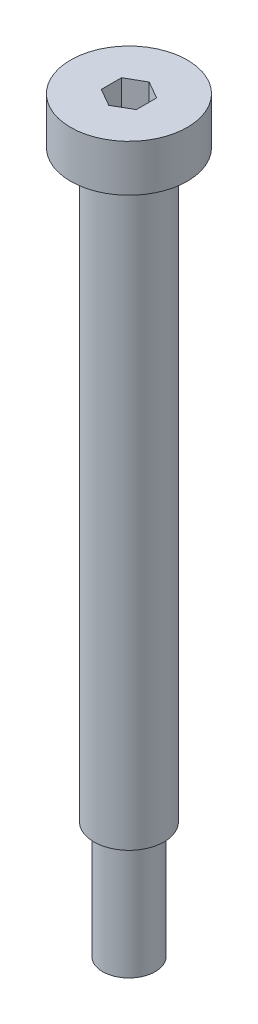
ISO-10303-21;
HEADER;
FILE_DESCRIPTION(('STEP AP214'),'2;1');
FILE_NAME('part.step','',(''),(''),'','','');
FILE_SCHEMA(('AUTOMOTIVE_DESIGN { 1 0 10303 214 1 1 1 1 }'));
ENDSEC;
DATA;
#1=APPLICATION_CONTEXT('core data for automotive mechanical design processes');
#2=APPLICATION_PROTOCOL_DEFINITION('international standard','automotive_design',2000,#1);
#3=PRODUCT_CONTEXT('',#1,'mechanical');
#4=PRODUCT('Part','Part','',(#3));
#5=PRODUCT_RELATED_PRODUCT_CATEGORY('part','',(#4));
#6=PRODUCT_DEFINITION_FORMATION('','',#4);
#7=PRODUCT_DEFINITION_CONTEXT('part definition',#1,'design');
#8=PRODUCT_DEFINITION('design','',#6,#7);
#9=PRODUCT_DEFINITION_SHAPE('','',#8);
#10=(LENGTH_UNIT() NAMED_UNIT(*) SI_UNIT(.MILLI.,.METRE.));
#11=(NAMED_UNIT(*) PLANE_ANGLE_UNIT() SI_UNIT($,.RADIAN.));
#12=(NAMED_UNIT(*) SI_UNIT($,.STERADIAN.) SOLID_ANGLE_UNIT());
#13=UNCERTAINTY_MEASURE_WITH_UNIT(LENGTH_MEASURE(1.E-05),#10,'distance_accuracy_value','');
#14=(GEOMETRIC_REPRESENTATION_CONTEXT(3) GLOBAL_UNCERTAINTY_ASSIGNED_CONTEXT((#13)) GLOBAL_UNIT_ASSIGNED_CONTEXT((#10,
#11,#12)) REPRESENTATION_CONTEXT('',''));
#15=CARTESIAN_POINT('',(0.,0.,0.));
#16=DIRECTION('',(0.,0.,1.));
#17=DIRECTION('',(1.,0.,0.));
#18=AXIS2_PLACEMENT_3D('',#15,#16,#17);
#19=CARTESIAN_POINT('',(0.,0.,0.));
#20=DIRECTION('',(0.,1.,0.));
#21=DIRECTION('',(0.,0.,1.));
#22=AXIS2_PLACEMENT_3D('',#19,#20,#21);
#23=PLANE('',#22);
#24=DIRECTION('',(0.,0.,-1.));
#25=VECTOR('',#24,1.);
#26=CARTESIAN_POINT('',(1.5,0.,0.866025403784439));
#27=LINE('',#26,#25);
#28=CARTESIAN_POINT('',(1.5,0.,0.866025403784439));
#29=VERTEX_POINT('',#28);
#30=CARTESIAN_POINT('',(1.5,0.,-0.866025403784439));
#31=VERTEX_POINT('',#30);
#32=EDGE_CURVE('E60',#29,#31,#27,.T.);
#33=ORIENTED_EDGE('',*,*,#32,.F.);
#34=DIRECTION('',(0.866025403784439,0.,-0.5));
#35=VECTOR('',#34,1.);
#36=CARTESIAN_POINT('',(0.,0.,1.73205080756888));
#37=LINE('',#36,#35);
#38=CARTESIAN_POINT('',(0.,0.,1.73205080756888));
#39=VERTEX_POINT('',#38);
#40=EDGE_CURVE('E153',#39,#29,#37,.T.);
#41=ORIENTED_EDGE('',*,*,#40,.F.);
#42=DIRECTION('',(0.866025403784439,0.,0.5));
#43=VECTOR('',#42,1.);
#44=CARTESIAN_POINT('',(-1.5,0.,0.866025403784439));
#45=LINE('',#44,#43);
#46=CARTESIAN_POINT('',(-1.5,0.,0.866025403784439));
#47=VERTEX_POINT('',#46);
#48=EDGE_CURVE('E150',#47,#39,#45,.T.);
#49=ORIENTED_EDGE('',*,*,#48,.F.);
#50=DIRECTION('',(0.,0.,1.));
#51=VECTOR('',#50,1.);
#52=CARTESIAN_POINT('',(-1.5,0.,-0.866025403784439));
#53=LINE('',#52,#51);
#54=CARTESIAN_POINT('',(-1.5,0.,-0.866025403784439));
#55=VERTEX_POINT('',#54);
#56=EDGE_CURVE('E108',#55,#47,#53,.T.);
#57=ORIENTED_EDGE('',*,*,#56,.F.);
#58=DIRECTION('',(-0.866025403784439,0.,0.5));
#59=VECTOR('',#58,1.);
#60=CARTESIAN_POINT('',(0.,0.,-1.73205080756888));
#61=LINE('',#60,#59);
#62=CARTESIAN_POINT('',(0.,0.,-1.73205080756888));
#63=VERTEX_POINT('',#62);
#64=EDGE_CURVE('E144',#63,#55,#61,.T.);
#65=ORIENTED_EDGE('',*,*,#64,.F.);
#66=DIRECTION('',(-0.866025403784439,0.,-0.5));
#67=VECTOR('',#66,1.);
#68=CARTESIAN_POINT('',(1.5,0.,-0.866025403784439));
#69=LINE('',#68,#67);
#70=EDGE_CURVE('E140',#31,#63,#69,.T.);
#71=ORIENTED_EDGE('',*,*,#70,.F.);
#72=EDGE_LOOP('',(#33,#41,#49,#57,#65,#71));
#73=FACE_BOUND('',#72,.T.);
#74=CARTESIAN_POINT('',(0.,0.,0.));
#75=DIRECTION('',(0.,1.,0.));
#76=DIRECTION('',(0.,0.,1.));
#77=AXIS2_PLACEMENT_3D('',#74,#75,#76);
#78=CIRCLE('',#77,5.);
#79=CARTESIAN_POINT('',(0.,0.,5.));
#80=VERTEX_POINT('',#79);
#81=EDGE_CURVE('E11',#80,#80,#78,.T.);
#82=ORIENTED_EDGE('',*,*,#81,.T.);
#83=EDGE_LOOP('',(#82));
#84=FACE_BOUND('',#83,.T.);
#85=ADVANCED_FACE('F45',(#73,#84),#23,.T.);
#86=CARTESIAN_POINT('',(0.,0.,0.));
#87=DIRECTION('',(0.,1.,0.));
#88=DIRECTION('',(0.,0.,1.));
#89=AXIS2_PLACEMENT_3D('',#86,#87,#88);
#90=CYLINDRICAL_SURFACE('',#89,5.);
#91=CARTESIAN_POINT('',(0.,-4.,0.));
#92=DIRECTION('',(0.,1.,0.));
#93=DIRECTION('',(0.,0.,1.));
#94=AXIS2_PLACEMENT_3D('',#91,#92,#93);
#95=CIRCLE('',#94,5.);
#96=CARTESIAN_POINT('',(0.,-4.,5.));
#97=VERTEX_POINT('',#96);
#98=EDGE_CURVE('E53',#97,#97,#95,.T.);
#99=ORIENTED_EDGE('',*,*,#98,.T.);
#100=EDGE_LOOP('',(#99));
#101=FACE_BOUND('',#100,.T.);
#102=ORIENTED_EDGE('',*,*,#81,.F.);
#103=EDGE_LOOP('',(#102));
#104=FACE_BOUND('',#103,.T.);
#105=ADVANCED_FACE('F187',(#101,#104),#90,.T.);
#106=CARTESIAN_POINT('',(-5.,-4.,0.));
#107=DIRECTION('',(0.,-1.,0.));
#108=DIRECTION('',(0.,0.,-1.));
#109=AXIS2_PLACEMENT_3D('',#106,#107,#108);
#110=PLANE('',#109);
#111=CARTESIAN_POINT('',(0.,-4.,0.));
#112=DIRECTION('',(0.,1.,0.));
#113=DIRECTION('',(0.,0.,1.));
#114=AXIS2_PLACEMENT_3D('',#111,#112,#113);
#115=CIRCLE('',#114,2.99999999999999);
#116=CARTESIAN_POINT('',(0.,-4.,2.99999999999999));
#117=VERTEX_POINT('',#116);
#118=EDGE_CURVE('E180',#117,#117,#115,.T.);
#119=ORIENTED_EDGE('',*,*,#118,.T.);
#120=EDGE_LOOP('',(#119));
#121=FACE_BOUND('',#120,.T.);
#122=ORIENTED_EDGE('',*,*,#98,.F.);
#123=EDGE_LOOP('',(#122));
#124=FACE_BOUND('',#123,.T.);
#125=ADVANCED_FACE('F190',(#121,#124),#110,.T.);
#126=CARTESIAN_POINT('',(0.,0.,0.));
#127=DIRECTION('',(0.,1.,0.));
#128=DIRECTION('',(0.,0.,1.));
#129=AXIS2_PLACEMENT_3D('',#126,#127,#128);
#130=CYLINDRICAL_SURFACE('',#129,2.99999999999999);
#131=CARTESIAN_POINT('',(0.,-54.,0.));
#132=DIRECTION('',(0.,1.,0.));
#133=DIRECTION('',(0.,0.,1.));
#134=AXIS2_PLACEMENT_3D('',#131,#132,#133);
#135=CIRCLE('',#134,2.99999999999999);
#136=CARTESIAN_POINT('',(0.,-54.,2.99999999999999));
#137=VERTEX_POINT('',#136);
#138=EDGE_CURVE('E176',#137,#137,#135,.T.);
#139=ORIENTED_EDGE('',*,*,#138,.T.);
#140=EDGE_LOOP('',(#139));
#141=FACE_BOUND('',#140,.T.);
#142=ORIENTED_EDGE('',*,*,#118,.F.);
#143=EDGE_LOOP('',(#142));
#144=FACE_BOUND('',#143,.T.);
#145=ADVANCED_FACE('F192',(#141,#144),#130,.T.);
#146=CARTESIAN_POINT('',(-2.99999999999999,-54.,0.));
#147=DIRECTION('',(0.,-1.,0.));
#148=DIRECTION('',(0.,0.,-1.));
#149=AXIS2_PLACEMENT_3D('',#146,#147,#148);
#150=PLANE('',#149);
#151=CARTESIAN_POINT('',(0.,-54.,0.));
#152=DIRECTION('',(0.,1.,0.));
#153=DIRECTION('',(0.,0.,1.));
#154=AXIS2_PLACEMENT_3D('',#151,#152,#153);
#155=CIRCLE('',#154,2.24999999999999);
#156=CARTESIAN_POINT('',(0.,-54.,2.24999999999999));
#157=VERTEX_POINT('',#156);
#158=EDGE_CURVE('E172',#157,#157,#155,.T.);
#159=ORIENTED_EDGE('',*,*,#158,.T.);
#160=EDGE_LOOP('',(#159));
#161=FACE_BOUND('',#160,.T.);
#162=ORIENTED_EDGE('',*,*,#138,.F.);
#163=EDGE_LOOP('',(#162));
#164=FACE_BOUND('',#163,.T.);
#165=ADVANCED_FACE('F199',(#161,#164),#150,.T.);
#166=CARTESIAN_POINT('',(0.,0.,0.));
#167=DIRECTION('',(0.,1.,0.));
#168=DIRECTION('',(0.,0.,1.));
#169=AXIS2_PLACEMENT_3D('',#166,#167,#168);
#170=CYLINDRICAL_SURFACE('',#169,2.24999999999999);
#171=CARTESIAN_POINT('',(0.,-64.,0.));
#172=DIRECTION('',(0.,1.,0.));
#173=DIRECTION('',(0.,0.,1.));
#174=AXIS2_PLACEMENT_3D('',#171,#172,#173);
#175=CIRCLE('',#174,2.24999999999999);
#176=CARTESIAN_POINT('',(0.,-64.,2.24999999999999));
#177=VERTEX_POINT('',#176);
#178=EDGE_CURVE('E159',#177,#177,#175,.T.);
#179=ORIENTED_EDGE('',*,*,#178,.T.);
#180=EDGE_LOOP('',(#179));
#181=FACE_BOUND('',#180,.T.);
#182=ORIENTED_EDGE('',*,*,#158,.F.);
#183=EDGE_LOOP('',(#182));
#184=FACE_BOUND('',#183,.T.);
#185=ADVANCED_FACE('F226',(#181,#184),#170,.T.);
#186=CARTESIAN_POINT('',(-2.24999999999999,-64.,0.));
#187=DIRECTION('',(0.,-1.,0.));
#188=DIRECTION('',(0.,0.,-1.));
#189=AXIS2_PLACEMENT_3D('',#186,#187,#188);
#190=PLANE('',#189);
#191=ORIENTED_EDGE('',*,*,#178,.F.);
#192=EDGE_LOOP('',(#191));
#193=FACE_BOUND('',#192,.T.);
#194=ADVANCED_FACE('F220',(#193),#190,.T.);
#195=CARTESIAN_POINT('',(1.5,-3.,0.866025403784439));
#196=DIRECTION('',(1.,0.,0.));
#197=DIRECTION('',(0.,0.,-1.));
#198=AXIS2_PLACEMENT_3D('',#195,#196,#197);
#199=PLANE('',#198);
#200=ORIENTED_EDGE('',*,*,#32,.T.);
#201=DIRECTION('',(0.,1.,0.));
#202=VECTOR('',#201,1.);
#203=CARTESIAN_POINT('',(1.5,-3.,-0.866025403784439));
#204=LINE('',#203,#202);
#205=CARTESIAN_POINT('',(1.5,-3.,-0.866025403784439));
#206=VERTEX_POINT('',#205);
#207=EDGE_CURVE('E90',#206,#31,#204,.T.);
#208=ORIENTED_EDGE('',*,*,#207,.F.);
#209=DIRECTION('',(0.,0.,-1.));
#210=VECTOR('',#209,1.);
#211=CARTESIAN_POINT('',(1.5,-3.,0.866025403784439));
#212=LINE('',#211,#210);
#213=CARTESIAN_POINT('',(1.5,-3.,0.866025403784439));
#214=VERTEX_POINT('',#213);
#215=EDGE_CURVE('E156',#214,#206,#212,.T.);
#216=ORIENTED_EDGE('',*,*,#215,.F.);
#217=DIRECTION('',(0.,1.,0.));
#218=VECTOR('',#217,1.);
#219=CARTESIAN_POINT('',(1.5,-3.,0.866025403784439));
#220=LINE('',#219,#218);
#221=EDGE_CURVE('E68',#214,#29,#220,.T.);
#222=ORIENTED_EDGE('',*,*,#221,.T.);
#223=EDGE_LOOP('',(#200,#208,#216,#222));
#224=FACE_BOUND('',#223,.T.);
#225=ADVANCED_FACE('F218',(#224),#199,.F.);
#226=CARTESIAN_POINT('',(0.,-3.,1.73205080756888));
#227=DIRECTION('',(0.5,0.,0.866025403784439));
#228=DIRECTION('',(0.866025403784439,0.,-0.5));
#229=AXIS2_PLACEMENT_3D('',#226,#227,#228);
#230=PLANE('',#229);
#231=ORIENTED_EDGE('',*,*,#40,.T.);
#232=ORIENTED_EDGE('',*,*,#221,.F.);
#233=DIRECTION('',(0.866025403784439,0.,-0.5));
#234=VECTOR('',#233,1.);
#235=CARTESIAN_POINT('',(0.,-3.,1.73205080756888));
#236=LINE('',#235,#234);
#237=CARTESIAN_POINT('',(0.,-3.,1.73205080756888));
#238=VERTEX_POINT('',#237);
#239=EDGE_CURVE('E122',#238,#214,#236,.T.);
#240=ORIENTED_EDGE('',*,*,#239,.F.);
#241=DIRECTION('',(0.,1.,0.));
#242=VECTOR('',#241,1.);
#243=CARTESIAN_POINT('',(0.,-3.,1.73205080756888));
#244=LINE('',#243,#242);
#245=EDGE_CURVE('E113',#238,#39,#244,.T.);
#246=ORIENTED_EDGE('',*,*,#245,.T.);
#247=EDGE_LOOP('',(#231,#232,#240,#246));
#248=FACE_BOUND('',#247,.T.);
#249=ADVANCED_FACE('F219',(#248),#230,.F.);
#250=CARTESIAN_POINT('',(-1.5,-3.,0.866025403784439));
#251=DIRECTION('',(-0.5,0.,0.866025403784439));
#252=DIRECTION('',(0.866025403784439,0.,0.5));
#253=AXIS2_PLACEMENT_3D('',#250,#251,#252);
#254=PLANE('',#253);
#255=ORIENTED_EDGE('',*,*,#48,.T.);
#256=ORIENTED_EDGE('',*,*,#245,.F.);
#257=DIRECTION('',(0.866025403784439,0.,0.5));
#258=VECTOR('',#257,1.);
#259=CARTESIAN_POINT('',(-1.5,-3.,0.866025403784439));
#260=LINE('',#259,#258);
#261=CARTESIAN_POINT('',(-1.5,-3.,0.866025403784439));
#262=VERTEX_POINT('',#261);
#263=EDGE_CURVE('E117',#262,#238,#260,.T.);
#264=ORIENTED_EDGE('',*,*,#263,.F.);
#265=DIRECTION('',(0.,1.,0.));
#266=VECTOR('',#265,1.);
#267=CARTESIAN_POINT('',(-1.5,-3.,0.866025403784439));
#268=LINE('',#267,#266);
#269=EDGE_CURVE('E101',#262,#47,#268,.T.);
#270=ORIENTED_EDGE('',*,*,#269,.T.);
#271=EDGE_LOOP('',(#255,#256,#264,#270));
#272=FACE_BOUND('',#271,.T.);
#273=ADVANCED_FACE('F118',(#272),#254,.F.);
#274=CARTESIAN_POINT('',(-1.5,-3.,-0.866025403784439));
#275=DIRECTION('',(-1.,0.,0.));
#276=DIRECTION('',(0.,0.,1.));
#277=AXIS2_PLACEMENT_3D('',#274,#275,#276);
#278=PLANE('',#277);
#279=ORIENTED_EDGE('',*,*,#56,.T.);
#280=ORIENTED_EDGE('',*,*,#269,.F.);
#281=DIRECTION('',(0.,0.,1.));
#282=VECTOR('',#281,1.);
#283=CARTESIAN_POINT('',(-1.5,-3.,-0.866025403784439));
#284=LINE('',#283,#282);
#285=CARTESIAN_POINT('',(-1.5,-3.,-0.866025403784439));
#286=VERTEX_POINT('',#285);
#287=EDGE_CURVE('E105',#286,#262,#284,.T.);
#288=ORIENTED_EDGE('',*,*,#287,.F.);
#289=DIRECTION('',(0.,1.,0.));
#290=VECTOR('',#289,1.);
#291=CARTESIAN_POINT('',(-1.5,-3.,-0.866025403784439));
#292=LINE('',#291,#290);
#293=EDGE_CURVE('E114',#286,#55,#292,.T.);
#294=ORIENTED_EDGE('',*,*,#293,.T.);
#295=EDGE_LOOP('',(#279,#280,#288,#294));
#296=FACE_BOUND('',#295,.T.);
#297=ADVANCED_FACE('F103',(#296),#278,.F.);
#298=CARTESIAN_POINT('',(0.,-3.,-1.73205080756888));
#299=DIRECTION('',(-0.5,0.,-0.866025403784439));
#300=DIRECTION('',(-0.866025403784439,0.,0.5));
#301=AXIS2_PLACEMENT_3D('',#298,#299,#300);
#302=PLANE('',#301);
#303=ORIENTED_EDGE('',*,*,#64,.T.);
#304=ORIENTED_EDGE('',*,*,#293,.F.);
#305=DIRECTION('',(-0.866025403784439,0.,0.5));
#306=VECTOR('',#305,1.);
#307=CARTESIAN_POINT('',(0.,-3.,-1.73205080756888));
#308=LINE('',#307,#306);
#309=CARTESIAN_POINT('',(0.,-3.,-1.73205080756888));
#310=VERTEX_POINT('',#309);
#311=EDGE_CURVE('E128',#310,#286,#308,.T.);
#312=ORIENTED_EDGE('',*,*,#311,.F.);
#313=DIRECTION('',(0.,1.,0.));
#314=VECTOR('',#313,1.);
#315=CARTESIAN_POINT('',(0.,-3.,-1.73205080756888));
#316=LINE('',#315,#314);
#317=EDGE_CURVE('E164',#310,#63,#316,.T.);
#318=ORIENTED_EDGE('',*,*,#317,.T.);
#319=EDGE_LOOP('',(#303,#304,#312,#318));
#320=FACE_BOUND('',#319,.T.);
#321=ADVANCED_FACE('F285',(#320),#302,.F.);
#322=CARTESIAN_POINT('',(1.5,-3.,-0.866025403784439));
#323=DIRECTION('',(0.5,0.,-0.866025403784439));
#324=DIRECTION('',(-0.866025403784439,0.,-0.5));
#325=AXIS2_PLACEMENT_3D('',#322,#323,#324);
#326=PLANE('',#325);
#327=ORIENTED_EDGE('',*,*,#70,.T.);
#328=ORIENTED_EDGE('',*,*,#317,.F.);
#329=DIRECTION('',(-0.866025403784439,0.,-0.5));
#330=VECTOR('',#329,1.);
#331=CARTESIAN_POINT('',(1.5,-3.,-0.866025403784439));
#332=LINE('',#331,#330);
#333=EDGE_CURVE('E132',#206,#310,#332,.T.);
#334=ORIENTED_EDGE('',*,*,#333,.F.);
#335=ORIENTED_EDGE('',*,*,#207,.T.);
#336=EDGE_LOOP('',(#327,#328,#334,#335));
#337=FACE_BOUND('',#336,.T.);
#338=ADVANCED_FACE('F214',(#337),#326,.F.);
#339=CARTESIAN_POINT('',(0.,-3.,0.));
#340=DIRECTION('',(0.,1.,0.));
#341=DIRECTION('',(0.,0.,1.));
#342=AXIS2_PLACEMENT_3D('',#339,#340,#341);
#343=PLANE('',#342);
#344=ORIENTED_EDGE('',*,*,#215,.T.);
#345=ORIENTED_EDGE('',*,*,#333,.T.);
#346=ORIENTED_EDGE('',*,*,#311,.T.);
#347=ORIENTED_EDGE('',*,*,#287,.T.);
#348=ORIENTED_EDGE('',*,*,#263,.T.);
#349=ORIENTED_EDGE('',*,*,#239,.T.);
#350=EDGE_LOOP('',(#344,#345,#346,#347,#348,#349));
#351=FACE_BOUND('',#350,.T.);
#352=ADVANCED_FACE('F125',(#351),#343,.T.);
#353=CLOSED_SHELL('',(#85,#105,#125,#145,#165,#185,#194,#225,#249,#273,#297,#321,#338,#352));
#354=MANIFOLD_SOLID_BREP('B2',#353);
#355=ADVANCED_BREP_SHAPE_REPRESENTATION('',(#18,#354),#14);
#356=SHAPE_DEFINITION_REPRESENTATION(#9,#355);
ENDSEC;
END-ISO-10303-21;
